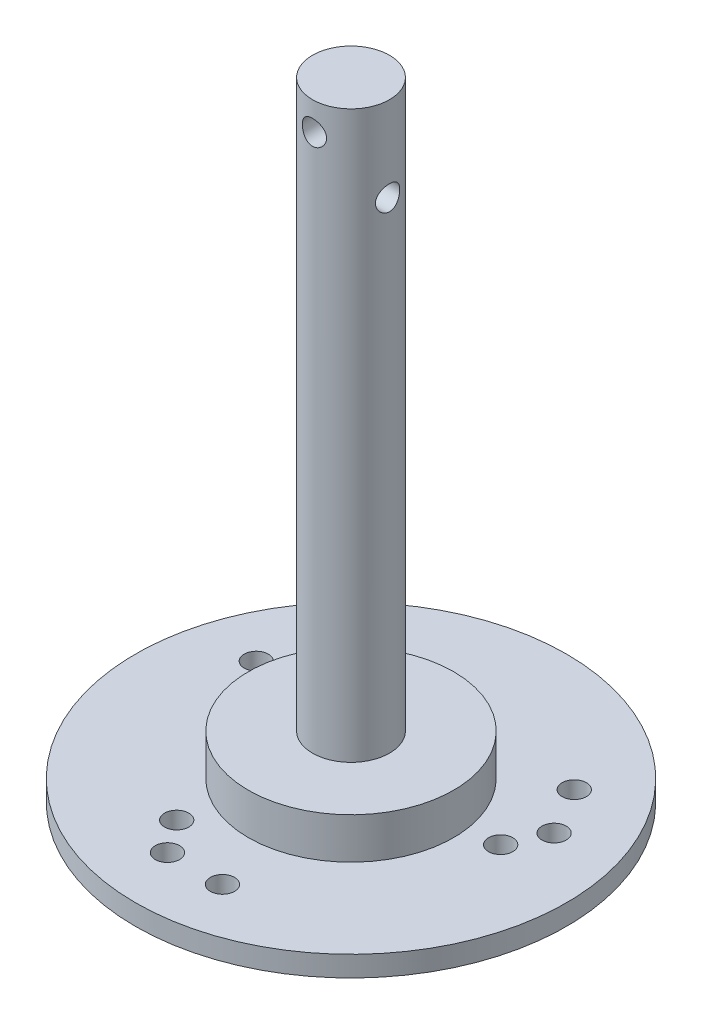
ISO-10303-21;
HEADER;
FILE_DESCRIPTION(('STEP AP214'),'2;1');
FILE_NAME('part.step','',(''),(''),'','','');
FILE_SCHEMA(('AUTOMOTIVE_DESIGN { 1 0 10303 214 1 1 1 1 }'));
ENDSEC;
DATA;
#1=APPLICATION_CONTEXT('core data for automotive mechanical design processes');
#2=APPLICATION_PROTOCOL_DEFINITION('international standard','automotive_design',2000,#1);
#3=PRODUCT_CONTEXT('',#1,'mechanical');
#4=PRODUCT('Part','Part','',(#3));
#5=PRODUCT_RELATED_PRODUCT_CATEGORY('part','',(#4));
#6=PRODUCT_DEFINITION_FORMATION('','',#4);
#7=PRODUCT_DEFINITION_CONTEXT('part definition',#1,'design');
#8=PRODUCT_DEFINITION('design','',#6,#7);
#9=PRODUCT_DEFINITION_SHAPE('','',#8);
#10=(LENGTH_UNIT() NAMED_UNIT(*) SI_UNIT(.MILLI.,.METRE.));
#11=(NAMED_UNIT(*) PLANE_ANGLE_UNIT() SI_UNIT($,.RADIAN.));
#12=(NAMED_UNIT(*) SI_UNIT($,.STERADIAN.) SOLID_ANGLE_UNIT());
#13=UNCERTAINTY_MEASURE_WITH_UNIT(LENGTH_MEASURE(1.E-05),#10,'distance_accuracy_value','');
#14=(GEOMETRIC_REPRESENTATION_CONTEXT(3) GLOBAL_UNCERTAINTY_ASSIGNED_CONTEXT((#13)) GLOBAL_UNIT_ASSIGNED_CONTEXT((#10,
#11,#12)) REPRESENTATION_CONTEXT('',''));
#15=CARTESIAN_POINT('',(0.,0.,0.));
#16=DIRECTION('',(0.,0.,1.));
#17=DIRECTION('',(1.,0.,0.));
#18=AXIS2_PLACEMENT_3D('',#15,#16,#17);
#19=CARTESIAN_POINT('',(0.,77.62,0.));
#20=DIRECTION('',(0.,-1.,0.));
#21=DIRECTION('',(0.,0.,-1.));
#22=AXIS2_PLACEMENT_3D('',#19,#20,#21);
#23=CYLINDRICAL_SURFACE('',#22,4.7625);
#24=CARTESIAN_POINT('',(-4.52011130947015,67.12,-1.5));
#25=CARTESIAN_POINT('',(-4.52011173724343,67.2019804685296,-1.49999954564444));
#26=CARTESIAN_POINT('',(-4.5223660070771,67.2839656635691,-1.49325639445375));
#27=CARTESIAN_POINT('',(-4.53109886590569,67.4455251033046,-1.46654069165984));
#28=CARTESIAN_POINT('',(-4.5375785433984,67.5250987212306,-1.44656473116124));
#29=CARTESIAN_POINT('',(-4.55395708673474,67.6794711832663,-1.39414027161065));
#30=CARTESIAN_POINT('',(-4.56384982516421,67.7542783013962,-1.36171411250472));
#31=CARTESIAN_POINT('',(-4.58593127015384,67.8974118538357,-1.2853844702648));
#32=CARTESIAN_POINT('',(-4.59812039430986,67.9657371060202,-1.24147889904508));
#33=CARTESIAN_POINT('',(-4.62389830861985,68.0963518896077,-1.14179578317613));
#34=CARTESIAN_POINT('',(-4.63751918758323,68.1583819557449,-1.08568647899754));
#35=CARTESIAN_POINT('',(-4.66435305098383,68.272326181884,-0.963898321900081));
#36=CARTESIAN_POINT('',(-4.67756597729999,68.3242389060125,-0.898218112967675));
#37=CARTESIAN_POINT('',(-4.70246276544229,68.4176235014062,-0.7572842441769));
#38=CARTESIAN_POINT('',(-4.71410444532179,68.45882762819,-0.68184506673625));
#39=CARTESIAN_POINT('',(-4.73417193265332,68.5278615624376,-0.524678241098129));
#40=CARTESIAN_POINT('',(-4.74259850851281,68.5556945660024,-0.442952101097874));
#41=CARTESIAN_POINT('',(-4.75505919285339,68.5963282878752,-0.27824841829896));
#42=CARTESIAN_POINT('',(-4.75922263019441,68.609572593071,-0.195390275606228));
#43=CARTESIAN_POINT('',(-4.76314496403151,68.6220590016072,-0.028530253511501));
#44=CARTESIAN_POINT('',(-4.76290487712207,68.6213043367396,0.055471357435676));
#45=CARTESIAN_POINT('',(-4.75813698845721,68.6061048356246,0.21910976515118));
#46=CARTESIAN_POINT('',(-4.7537598306821,68.5921409733277,0.29879632957199));
#47=CARTESIAN_POINT('',(-4.74139534318333,68.5517093628322,0.454631321505635));
#48=CARTESIAN_POINT('',(-4.73340777678625,68.5252407949066,0.530779516706506));
#49=CARTESIAN_POINT('',(-4.71451894088055,68.4602453764246,0.678479225128419));
#50=CARTESIAN_POINT('',(-4.70358290066036,68.4215736231384,0.749962343658782));
#51=CARTESIAN_POINT('',(-4.67994776739616,68.33338617693,0.885573411351457));
#52=CARTESIAN_POINT('',(-4.66724822346395,68.2838677088715,0.949699471797855));
#53=CARTESIAN_POINT('',(-4.6408023227905,68.1729282916547,1.0716434109083));
#54=CARTESIAN_POINT('',(-4.62703440905435,68.1110924648665,1.12907970487737));
#55=CARTESIAN_POINT('',(-4.60046587487755,67.9785389816725,1.23288208823769));
#56=CARTESIAN_POINT('',(-4.58766537228425,67.9078202459594,1.27924683040404));
#57=CARTESIAN_POINT('',(-4.56437114253873,67.7584153005564,1.36004342286531));
#58=CARTESIAN_POINT('',(-4.55390567751298,67.6796467167133,1.39433170656465));
#59=CARTESIAN_POINT('',(-4.53679740489525,67.5170442037247,1.44903645237758));
#60=CARTESIAN_POINT('',(-4.53015319817403,67.4332121409788,1.46945799220596));
#61=CARTESIAN_POINT('',(-4.52175098632741,67.2665229694861,1.49510872950811));
#62=CARTESIAN_POINT('',(-4.51980490166813,67.1837653396618,1.50092310350083));
#63=CARTESIAN_POINT('',(-4.52049667763256,67.0184504608645,1.49883894622849));
#64=CARTESIAN_POINT('',(-4.5231338161791,66.9358931823785,1.49094257506264));
#65=CARTESIAN_POINT('',(-4.53250899846867,66.7758579736384,1.4621843872396));
#66=CARTESIAN_POINT('',(-4.53912367534059,66.6983020434618,1.44171222343744));
#67=CARTESIAN_POINT('',(-4.5555773404356,66.5477354014585,1.38884221695067));
#68=CARTESIAN_POINT('',(-4.56541685997232,66.47472544097,1.35644240900118));
#69=CARTESIAN_POINT('',(-4.5875661685916,66.3329764980495,1.27956359162618));
#70=CARTESIAN_POINT('',(-4.59993939567821,66.2644231123611,1.23476112964434));
#71=CARTESIAN_POINT('',(-4.62563158950432,66.135594549006,1.13472510058494));
#72=CARTESIAN_POINT('',(-4.63895080519946,66.0753215628277,1.07948878123648));
#73=CARTESIAN_POINT('',(-4.66571432896043,65.9621403900783,0.957380822492026));
#74=CARTESIAN_POINT('',(-4.67914019764135,65.9096503207716,0.890116547378786));
#75=CARTESIAN_POINT('',(-4.70404342852271,65.8166850315299,0.747409036881234));
#76=CARTESIAN_POINT('',(-4.7155208781101,65.7762092726899,0.671966168557104));
#77=CARTESIAN_POINT('',(-4.73516965758402,65.7088085866186,0.515499128628182));
#78=CARTESIAN_POINT('',(-4.74336462760992,65.6817864117285,0.434519970360086));
#79=CARTESIAN_POINT('',(-4.75562892693074,65.6418368045526,0.268862186633179));
#80=CARTESIAN_POINT('',(-4.7596995697377,65.6289048847159,0.184184747966871));
#81=CARTESIAN_POINT('',(-4.76316812910613,65.6178720274844,0.0173800030300875));
#82=CARTESIAN_POINT('',(-4.7627561939037,65.6191675910606,-0.0647039004262381));
#83=CARTESIAN_POINT('',(-4.75776280175711,65.6350901316138,-0.227431433827691));
#84=CARTESIAN_POINT('',(-4.7531816240151,65.6497162158843,-0.308075159848632));
#85=CARTESIAN_POINT('',(-4.74042579804042,65.691498338664,-0.464611043112042));
#86=CARTESIAN_POINT('',(-4.73229818227345,65.7184906047111,-0.540551013984441));
#87=CARTESIAN_POINT('',(-4.71328739017827,65.7840905737587,-0.686860162672989));
#88=CARTESIAN_POINT('',(-4.70240373774132,65.8227002839042,-0.757228375201079));
#89=CARTESIAN_POINT('',(-4.67855051458417,65.9119694921417,-0.893022510496728));
#90=CARTESIAN_POINT('',(-4.66552221657063,65.962996767363,-0.95819623605194));
#91=CARTESIAN_POINT('',(-4.63901505495011,66.0750066762613,-1.07925589037362));
#92=CARTESIAN_POINT('',(-4.625536056482,66.1359923113221,-1.13513900873306));
#93=CARTESIAN_POINT('',(-4.59911174194361,66.2686586271034,-1.23793947370086));
#94=CARTESIAN_POINT('',(-4.58619987925646,66.3406312005729,-1.2844897932597));
#95=CARTESIAN_POINT('',(-4.56295119801333,66.4917678493862,-1.36478549823726));
#96=CARTESIAN_POINT('',(-4.55261337918119,66.5709291148252,-1.39853586040865));
#97=CARTESIAN_POINT('',(-4.5364946057853,66.7276347271333,-1.44992789095279));
#98=CARTESIAN_POINT('',(-4.53041341739238,66.8047947180642,-1.46864906697571));
#99=CARTESIAN_POINT('',(-4.522222071456,66.9613020408071,-1.49368375021279));
#100=CARTESIAN_POINT('',(-4.52011089541641,67.0406488063062,-1.50000043978349));
#101=CARTESIAN_POINT('',(-4.52011130947015,67.12,-1.5));
#102=B_SPLINE_CURVE_WITH_KNOTS('',3,(#24,#25,#26,#27,#28,#29,#30,#31,#32,#33,#34,#35,#36,#37,
#38,#39,#40,#41,#42,#43,#44,#45,#46,#47,#48,#49,#50,#51,#52,#53,#54,#55,#56,#57,#58,#59,#60,#61,
#62,#63,#64,#65,#66,#67,#68,#69,#70,#71,#72,#73,#74,#75,#76,#77,#78,#79,#80,#81,#82,#83,#84,#85,
#86,#87,#88,#89,#90,#91,#92,#93,#94,#95,#96,#97,#98,#99,#100,#101),.UNSPECIFIED.,.T.,.F.,(4,2,2,
2,2,2,2,2,2,2,2,2,2,2,2,2,2,2,2,2,2,2,2,2,2,2,2,2,2,2,2,2,2,2,2,2,2,2,4),(0.,0.245648203126428,
0.491359712148026,0.736632375067864,0.981949683748545,1.23503109015801,1.48814838827187,
1.74709020623268,2.0059700984681,2.2567403473535,2.50745270432617,2.74937382904362,
2.9913108147377,3.23623614631163,3.48122421547844,3.73657545717518,3.99195775508278,
4.25028100806216,4.50850961732455,4.75621541436285,5.00388218941215,5.24423725552354,
5.48463194160758,5.73200759515815,5.9794485934769,6.23733132721896,6.49520249181667,
6.75118157446127,7.00707910746647,7.25216544829859,7.49723537761206,7.73914956069726,
7.98110556330012,8.23135791184304,8.48168582447559,8.74047758731523,8.99916862589578,
9.23699943128558,9.47476921348418),.UNSPECIFIED.);
#103=CARTESIAN_POINT('',(-4.52011130947015,67.12,-1.5));
#104=VERTEX_POINT('',#103);
#105=EDGE_CURVE('E34',#104,#104,#102,.T.);
#106=ORIENTED_EDGE('',*,*,#105,.T.);
#107=EDGE_LOOP('',(#106));
#108=FACE_BOUND('',#107,.T.);
#109=CARTESIAN_POINT('',(4.52011130947015,67.12,-1.5));
#110=CARTESIAN_POINT('',(4.52011173724343,67.0380195314704,-1.49999954564444));
#111=CARTESIAN_POINT('',(4.5223660070771,66.9560343364309,-1.49325639445375));
#112=CARTESIAN_POINT('',(4.53109886590569,66.7944748966954,-1.46654069165984));
#113=CARTESIAN_POINT('',(4.5375785433984,66.7149012787694,-1.44656473116124));
#114=CARTESIAN_POINT('',(4.55395708673474,66.5605288167337,-1.39414027161065));
#115=CARTESIAN_POINT('',(4.56384982516421,66.4857216986038,-1.36171411250472));
#116=CARTESIAN_POINT('',(4.58593127015384,66.3425881461643,-1.2853844702648));
#117=CARTESIAN_POINT('',(4.59812039430986,66.2742628939798,-1.24147889904508));
#118=CARTESIAN_POINT('',(4.62389830861985,66.1436481103923,-1.14179578317613));
#119=CARTESIAN_POINT('',(4.63751918758323,66.0816180442551,-1.08568647899754));
#120=CARTESIAN_POINT('',(4.66435305098383,65.9676738181161,-0.963898321900081));
#121=CARTESIAN_POINT('',(4.67756597729999,65.9157610939876,-0.898218112967675));
#122=CARTESIAN_POINT('',(4.70246276544229,65.8223764985939,-0.7572842441769));
#123=CARTESIAN_POINT('',(4.71410444532179,65.78117237181,-0.68184506673625));
#124=CARTESIAN_POINT('',(4.73417193265332,65.7121384375624,-0.524678241098129));
#125=CARTESIAN_POINT('',(4.74259850851281,65.6843054339976,-0.442952101097874));
#126=CARTESIAN_POINT('',(4.75505919285339,65.6436717121248,-0.27824841829896));
#127=CARTESIAN_POINT('',(4.75922263019441,65.630427406929,-0.195390275606228));
#128=CARTESIAN_POINT('',(4.76314496403151,65.6179409983928,-0.028530253511501));
#129=CARTESIAN_POINT('',(4.76290487712207,65.6186956632605,0.055471357435676));
#130=CARTESIAN_POINT('',(4.75813698845721,65.6338951643754,0.21910976515118));
#131=CARTESIAN_POINT('',(4.7537598306821,65.6478590266723,0.29879632957199));
#132=CARTESIAN_POINT('',(4.74139534318333,65.6882906371678,0.454631321505635));
#133=CARTESIAN_POINT('',(4.73340777678625,65.7147592050935,0.530779516706506));
#134=CARTESIAN_POINT('',(4.71451894088055,65.7797546235754,0.678479225128419));
#135=CARTESIAN_POINT('',(4.70358290066036,65.8184263768616,0.749962343658782));
#136=CARTESIAN_POINT('',(4.67994776739616,65.90661382307,0.885573411351457));
#137=CARTESIAN_POINT('',(4.66724822346395,65.9561322911286,0.949699471797855));
#138=CARTESIAN_POINT('',(4.6408023227905,66.0670717083454,1.0716434109083));
#139=CARTESIAN_POINT('',(4.62703440905435,66.1289075351335,1.12907970487737));
#140=CARTESIAN_POINT('',(4.60046587487755,66.2614610183275,1.23288208823769));
#141=CARTESIAN_POINT('',(4.58766537228425,66.3321797540406,1.27924683040404));
#142=CARTESIAN_POINT('',(4.56437114253873,66.4815846994436,1.36004342286531));
#143=CARTESIAN_POINT('',(4.55390567751298,66.5603532832867,1.39433170656465));
#144=CARTESIAN_POINT('',(4.53679740489525,66.7229557962753,1.44903645237758));
#145=CARTESIAN_POINT('',(4.53015319817403,66.8067878590212,1.46945799220596));
#146=CARTESIAN_POINT('',(4.52175098632741,66.9734770305139,1.49510872950811));
#147=CARTESIAN_POINT('',(4.51980490166813,67.0562346603382,1.50092310350083));
#148=CARTESIAN_POINT('',(4.52049667763256,67.2215495391356,1.49883894622849));
#149=CARTESIAN_POINT('',(4.5231338161791,67.3041068176215,1.49094257506264));
#150=CARTESIAN_POINT('',(4.53250899846867,67.4641420263616,1.4621843872396));
#151=CARTESIAN_POINT('',(4.53912367534059,67.5416979565382,1.44171222343744));
#152=CARTESIAN_POINT('',(4.55557734043559,67.6922645985415,1.38884221695067));
#153=CARTESIAN_POINT('',(4.56541685997232,67.76527455903,1.35644240900118));
#154=CARTESIAN_POINT('',(4.5875661685916,67.9070235019505,1.27956359162618));
#155=CARTESIAN_POINT('',(4.59993939567821,67.9755768876389,1.23476112964434));
#156=CARTESIAN_POINT('',(4.62563158950432,68.104405450994,1.13472510058494));
#157=CARTESIAN_POINT('',(4.63895080519946,68.1646784371723,1.07948878123648));
#158=CARTESIAN_POINT('',(4.66571432896043,68.2778596099217,0.957380822492026));
#159=CARTESIAN_POINT('',(4.67914019764135,68.3303496792284,0.890116547378786));
#160=CARTESIAN_POINT('',(4.70404342852271,68.4233149684702,0.747409036881234));
#161=CARTESIAN_POINT('',(4.7155208781101,68.4637907273101,0.671966168557104));
#162=CARTESIAN_POINT('',(4.73516965758402,68.5311914133814,0.515499128628181));
#163=CARTESIAN_POINT('',(4.74336462760992,68.5582135882715,0.434519970360084));
#164=CARTESIAN_POINT('',(4.75562892693074,68.5981631954475,0.268862186633177));
#165=CARTESIAN_POINT('',(4.7596995697377,68.6110951152841,0.18418474796687));
#166=CARTESIAN_POINT('',(4.76316812910613,68.6221279725157,0.0173800030300876));
#167=CARTESIAN_POINT('',(4.7627561939037,68.6208324089394,-0.0647039004262381));
#168=CARTESIAN_POINT('',(4.75776280175711,68.6049098683862,-0.227431433827691));
#169=CARTESIAN_POINT('',(4.7531816240151,68.5902837841157,-0.308075159848632));
#170=CARTESIAN_POINT('',(4.74042579804042,68.548501661336,-0.464611043112042));
#171=CARTESIAN_POINT('',(4.73229818227345,68.5215093952889,-0.540551013984441));
#172=CARTESIAN_POINT('',(4.71328739017827,68.4559094262413,-0.686860162672989));
#173=CARTESIAN_POINT('',(4.70240373774132,68.4172997160959,-0.757228375201079));
#174=CARTESIAN_POINT('',(4.67855051458417,68.3280305078583,-0.893022510496728));
#175=CARTESIAN_POINT('',(4.66552221657063,68.2770032326371,-0.95819623605194));
#176=CARTESIAN_POINT('',(4.63901505495011,68.1649933237387,-1.07925589037362));
#177=CARTESIAN_POINT('',(4.625536056482,68.104007688678,-1.13513900873306));
#178=CARTESIAN_POINT('',(4.59911174194361,67.9713413728966,-1.23793947370086));
#179=CARTESIAN_POINT('',(4.58619987925646,67.8993687994271,-1.2844897932597));
#180=CARTESIAN_POINT('',(4.56295119801333,67.7482321506138,-1.36478549823726));
#181=CARTESIAN_POINT('',(4.55261337918119,67.6690708851748,-1.39853586040865));
#182=CARTESIAN_POINT('',(4.5364946057853,67.5123652728667,-1.44992789095279));
#183=CARTESIAN_POINT('',(4.53041341739238,67.4352052819358,-1.46864906697571));
#184=CARTESIAN_POINT('',(4.522222071456,67.2786979591929,-1.49368375021279));
#185=CARTESIAN_POINT('',(4.52011089541641,67.1993511936938,-1.50000043978349));
#186=CARTESIAN_POINT('',(4.52011130947015,67.12,-1.5));
#187=B_SPLINE_CURVE_WITH_KNOTS('',3,(#109,#110,#111,#112,#113,#114,#115,#116,#117,#118,#119,
#120,#121,#122,#123,#124,#125,#126,#127,#128,#129,#130,#131,#132,#133,#134,#135,#136,#137,#138,
#139,#140,#141,#142,#143,#144,#145,#146,#147,#148,#149,#150,#151,#152,#153,#154,#155,#156,#157,
#158,#159,#160,#161,#162,#163,#164,#165,#166,#167,#168,#169,#170,#171,#172,#173,#174,#175,#176,
#177,#178,#179,#180,#181,#182,#183,#184,#185,#186),.UNSPECIFIED.,.T.,.F.,(4,2,2,2,2,2,2,2,2,2,2,
2,2,2,2,2,2,2,2,2,2,2,2,2,2,2,2,2,2,2,2,2,2,2,2,2,2,2,4),(0.,0.245648203126428,
0.491359712148026,0.736632375067864,0.981949683748545,1.23503109015801,1.48814838827187,
1.74709020623268,2.0059700984681,2.2567403473535,2.50745270432617,2.74937382904362,
2.9913108147377,3.23623614631163,3.48122421547844,3.73657545717518,3.99195775508278,
4.25028100806216,4.50850961732455,4.75621541436285,5.00388218941215,5.24423725552352,
5.48463194160758,5.73200759515815,5.9794485934769,6.23733132721896,6.49520249181667,
6.75118157446127,7.00707910746647,7.25216544829859,7.49723537761206,7.73914956069726,
7.98110556330012,8.23135791184304,8.48168582447559,8.74047758731523,8.99916862589578,
9.23699943128558,9.47476921348418),.UNSPECIFIED.);
#188=CARTESIAN_POINT('',(4.52011130947015,67.12,-1.5));
#189=VERTEX_POINT('',#188);
#190=EDGE_CURVE('E134',#189,#189,#187,.T.);
#191=ORIENTED_EDGE('',*,*,#190,.T.);
#192=EDGE_LOOP('',(#191));
#193=FACE_BOUND('',#192,.T.);
#194=CARTESIAN_POINT('',(0.,77.62,0.));
#195=DIRECTION('',(0.,1.,0.));
#196=DIRECTION('',(0.,0.,1.));
#197=AXIS2_PLACEMENT_3D('',#194,#195,#196);
#198=CIRCLE('',#197,4.7625);
#199=CARTESIAN_POINT('',(0.,77.62,4.7625));
#200=VERTEX_POINT('',#199);
#201=EDGE_CURVE('E137',#200,#200,#198,.T.);
#202=ORIENTED_EDGE('',*,*,#201,.F.);
#203=EDGE_LOOP('',(#202));
#204=FACE_BOUND('',#203,.T.);
#205=CARTESIAN_POINT('',(0.,7.62,0.));
#206=DIRECTION('',(0.,1.,0.));
#207=DIRECTION('',(0.,0.,1.));
#208=AXIS2_PLACEMENT_3D('',#205,#206,#207);
#209=CIRCLE('',#208,4.7625);
#210=CARTESIAN_POINT('',(0.,7.62,4.7625));
#211=VERTEX_POINT('',#210);
#212=EDGE_CURVE('E141',#211,#211,#209,.T.);
#213=ORIENTED_EDGE('',*,*,#212,.T.);
#214=EDGE_LOOP('',(#213));
#215=FACE_BOUND('',#214,.T.);
#216=CARTESIAN_POINT('',(-1.5,74.12,4.52011130947016));
#217=CARTESIAN_POINT('',(-1.49999954564444,74.0380195314704,4.52011173724343));
#218=CARTESIAN_POINT('',(-1.49325639445375,73.9560343364309,4.5223660070771));
#219=CARTESIAN_POINT('',(-1.46654069165984,73.7944748966954,4.53109886590569));
#220=CARTESIAN_POINT('',(-1.44656473116124,73.7149012787694,4.5375785433984));
#221=CARTESIAN_POINT('',(-1.39414027161065,73.5605288167337,4.55395708673474));
#222=CARTESIAN_POINT('',(-1.36171411250471,73.4857216986038,4.56384982516422));
#223=CARTESIAN_POINT('',(-1.28538447026479,73.3425881461643,4.58593127015385));
#224=CARTESIAN_POINT('',(-1.24147889904508,73.2742628939798,4.59812039430986));
#225=CARTESIAN_POINT('',(-1.14179578317613,73.1436481103923,4.62389830861985));
#226=CARTESIAN_POINT('',(-1.08568647899755,73.0816180442551,4.63751918758323));
#227=CARTESIAN_POINT('',(-0.963898321900085,72.9676738181161,4.66435305098383));
#228=CARTESIAN_POINT('',(-0.898218112967676,72.9157610939876,4.67756597729999));
#229=CARTESIAN_POINT('',(-0.757284244176896,72.8223764985939,4.70246276544229));
#230=CARTESIAN_POINT('',(-0.681845066736244,72.78117237181,4.7141044453218));
#231=CARTESIAN_POINT('',(-0.524678241098124,72.7121384375624,4.73417193265332));
#232=CARTESIAN_POINT('',(-0.44295210109787,72.6843054339976,4.74259850851281));
#233=CARTESIAN_POINT('',(-0.278248418298957,72.6436717121248,4.75505919285339));
#234=CARTESIAN_POINT('',(-0.195390275606224,72.630427406929,4.75922263019441));
#235=CARTESIAN_POINT('',(-0.028530253511497,72.6179409983928,4.76314496403151));
#236=CARTESIAN_POINT('',(0.0554713574356791,72.6186956632604,4.76290487712207));
#237=CARTESIAN_POINT('',(0.219109765151183,72.6338951643754,4.75813698845721));
#238=CARTESIAN_POINT('',(0.298796329571994,72.6478590266723,4.7537598306821));
#239=CARTESIAN_POINT('',(0.454631321505639,72.6882906371678,4.74139534318333));
#240=CARTESIAN_POINT('',(0.530779516706508,72.7147592050935,4.73340777678625));
#241=CARTESIAN_POINT('',(0.678479225128419,72.7797546235754,4.71451894088055));
#242=CARTESIAN_POINT('',(0.749962343658782,72.8184263768616,4.70358290066036));
#243=CARTESIAN_POINT('',(0.885573411351458,72.90661382307,4.67994776739616));
#244=CARTESIAN_POINT('',(0.949699471797856,72.9561322911286,4.66724822346395));
#245=CARTESIAN_POINT('',(1.0716434109083,73.0670717083454,4.6408023227905));
#246=CARTESIAN_POINT('',(1.12907970487736,73.1289075351335,4.62703440905435));
#247=CARTESIAN_POINT('',(1.23288208823768,73.2614610183275,4.60046587487756));
#248=CARTESIAN_POINT('',(1.27924683040404,73.3321797540406,4.58766537228425));
#249=CARTESIAN_POINT('',(1.36004342286532,73.4815846994436,4.56437114253873));
#250=CARTESIAN_POINT('',(1.39433170656465,73.5603532832867,4.55390567751298));
#251=CARTESIAN_POINT('',(1.44903645237758,73.7229557962753,4.53679740489525));
#252=CARTESIAN_POINT('',(1.46945799220596,73.8067878590212,4.53015319817403));
#253=CARTESIAN_POINT('',(1.49510872950811,73.9734770305139,4.52175098632741));
#254=CARTESIAN_POINT('',(1.50092310350083,74.0562346603382,4.51980490166813));
#255=CARTESIAN_POINT('',(1.49883894622849,74.2215495391355,4.52049667763256));
#256=CARTESIAN_POINT('',(1.49094257506264,74.3041068176215,4.5231338161791));
#257=CARTESIAN_POINT('',(1.4621843872396,74.4641420263616,4.53250899846867));
#258=CARTESIAN_POINT('',(1.44171222343744,74.5416979565382,4.53912367534059));
#259=CARTESIAN_POINT('',(1.38884221695067,74.6922645985415,4.55557734043559));
#260=CARTESIAN_POINT('',(1.35644240900119,74.76527455903,4.56541685997232));
#261=CARTESIAN_POINT('',(1.27956359162618,74.9070235019505,4.5875661685916));
#262=CARTESIAN_POINT('',(1.23476112964434,74.9755768876389,4.59993939567821));
#263=CARTESIAN_POINT('',(1.13472510058493,75.104405450994,4.62563158950432));
#264=CARTESIAN_POINT('',(1.07948878123648,75.1646784371723,4.63895080519946));
#265=CARTESIAN_POINT('',(0.957380822492027,75.2778596099217,4.66571432896043));
#266=CARTESIAN_POINT('',(0.890116547378786,75.3303496792284,4.67914019764135));
#267=CARTESIAN_POINT('',(0.747409036881234,75.4233149684701,4.70404342852271));
#268=CARTESIAN_POINT('',(0.671966168557105,75.4637907273101,4.7155208781101));
#269=CARTESIAN_POINT('',(0.515499128628181,75.5311914133814,4.73516965758402));
#270=CARTESIAN_POINT('',(0.434519970360084,75.5582135882715,4.74336462760992));
#271=CARTESIAN_POINT('',(0.268862186633181,75.5981631954474,4.75562892693074));
#272=CARTESIAN_POINT('',(0.184184747966878,75.6110951152841,4.7596995697377));
#273=CARTESIAN_POINT('',(0.0173800030300984,75.6221279725157,4.76316812910613));
#274=CARTESIAN_POINT('',(-0.0647039004262289,75.6208324089394,4.76275619390371));
#275=CARTESIAN_POINT('',(-0.227431433827686,75.6049098683862,4.75776280175711));
#276=CARTESIAN_POINT('',(-0.308075159848628,75.5902837841157,4.7531816240151));
#277=CARTESIAN_POINT('',(-0.464611043112038,75.548501661336,4.74042579804042));
#278=CARTESIAN_POINT('',(-0.540551013984435,75.5215093952889,4.73229818227345));
#279=CARTESIAN_POINT('',(-0.686860162672982,75.4559094262413,4.71328739017827));
#280=CARTESIAN_POINT('',(-0.757228375201074,75.4172997160959,4.70240373774132));
#281=CARTESIAN_POINT('',(-0.893022510496727,75.3280305078583,4.67855051458417));
#282=CARTESIAN_POINT('',(-0.958196236051942,75.277003232637,4.66552221657063));
#283=CARTESIAN_POINT('',(-1.07925589037362,75.1649933237387,4.63901505495011));
#284=CARTESIAN_POINT('',(-1.13513900873306,75.104007688678,4.625536056482));
#285=CARTESIAN_POINT('',(-1.23793947370086,74.9713413728966,4.59911174194361));
#286=CARTESIAN_POINT('',(-1.2844897932597,74.8993687994271,4.58619987925646));
#287=CARTESIAN_POINT('',(-1.36478549823726,74.7482321506138,4.56295119801333));
#288=CARTESIAN_POINT('',(-1.39853586040865,74.6690708851748,4.5526133791812));
#289=CARTESIAN_POINT('',(-1.44992789095279,74.5123652728667,4.5364946057853));
#290=CARTESIAN_POINT('',(-1.46864906697571,74.4352052819358,4.53041341739238));
#291=CARTESIAN_POINT('',(-1.49368375021279,74.2786979591929,4.52222207145601));
#292=CARTESIAN_POINT('',(-1.50000043978349,74.1993511936938,4.52011089541641));
#293=CARTESIAN_POINT('',(-1.5,74.12,4.52011130947016));
#294=B_SPLINE_CURVE_WITH_KNOTS('',3,(#216,#217,#218,#219,#220,#221,#222,#223,#224,#225,#226,
#227,#228,#229,#230,#231,#232,#233,#234,#235,#236,#237,#238,#239,#240,#241,#242,#243,#244,#245,
#246,#247,#248,#249,#250,#251,#252,#253,#254,#255,#256,#257,#258,#259,#260,#261,#262,#263,#264,
#265,#266,#267,#268,#269,#270,#271,#272,#273,#274,#275,#276,#277,#278,#279,#280,#281,#282,#283,
#284,#285,#286,#287,#288,#289,#290,#291,#292,#293),.UNSPECIFIED.,.T.,.F.,(4,2,2,2,2,2,2,2,2,2,2,
2,2,2,2,2,2,2,2,2,2,2,2,2,2,2,2,2,2,2,2,2,2,2,2,2,2,2,4),(0.,0.245648203126428,
0.491359712148026,0.73663237506788,0.981949683748546,1.23503109015801,1.48814838827187,
1.74709020623269,2.0059700984681,2.2567403473535,2.50745270432617,2.74937382904362,
2.99131081473769,3.23623614631162,3.48122421547843,3.73657545717517,3.99195775508277,
4.25028100806217,4.50850961732454,4.75621541436285,5.00388218941215,5.24423725552352,
5.48463194160758,5.73200759515814,5.9794485934769,6.23733132721896,6.49520249181667,
6.75118157446126,7.00707910746645,7.25216544829857,7.49723537761204,7.73914956069724,
7.98110556330011,8.23135791184303,8.48168582447558,8.74047758731523,8.99916862589578,
9.23699943128559,9.47476921348417),.UNSPECIFIED.);
#295=CARTESIAN_POINT('',(-1.5,74.12,4.52011130947016));
#296=VERTEX_POINT('',#295);
#297=EDGE_CURVE('E54',#296,#296,#294,.T.);
#298=ORIENTED_EDGE('',*,*,#297,.F.);
#299=EDGE_LOOP('',(#298));
#300=FACE_BOUND('',#299,.T.);
#301=CARTESIAN_POINT('',(0.,75.62,-4.7625));
#302=CARTESIAN_POINT('',(0.082094536907181,75.6199995623379,-4.76249965633041));
#303=CARTESIAN_POINT('',(0.164193787469988,75.6132383096738,-4.76035733490875));
#304=CARTESIAN_POINT('',(0.325989355341718,75.5864441881315,-4.75202120517305));
#305=CARTESIAN_POINT('',(0.405685159405637,75.5664085052491,-4.74582653781861));
#306=CARTESIAN_POINT('',(0.560317406743354,75.5138096294532,-4.73006202417898));
#307=CARTESIAN_POINT('',(0.635261073505161,75.4812660082106,-4.72049745285487));
#308=CARTESIAN_POINT('',(0.778627633748063,75.4046589197923,-4.69897937584265));
#309=CARTESIAN_POINT('',(0.847049466091455,75.360593582322,-4.68702548237547));
#310=CARTESIAN_POINT('',(0.977573385140228,75.2607414790958,-4.66157762848587));
#311=CARTESIAN_POINT('',(1.03944258820892,75.2046589802329,-4.64804972270609));
#312=CARTESIAN_POINT('',(1.15307123875255,75.0829940956753,-4.62117398380975));
#313=CARTESIAN_POINT('',(1.2048287662608,75.0174099099453,-4.60782618533831));
#314=CARTESIAN_POINT('',(1.2980352255659,74.8765780296787,-4.58245665177123));
#315=CARTESIAN_POINT('',(1.33919187571196,74.8011286420788,-4.570476753683));
#316=CARTESIAN_POINT('',(1.40813539569475,74.643941010047,-4.54971062762424));
#317=CARTESIAN_POINT('',(1.4359258507859,74.5622044588705,-4.54092354339052));
#318=CARTESIAN_POINT('',(1.47649347933875,74.3973930743414,-4.52789329226847));
#319=CARTESIAN_POINT('',(1.48970317080108,74.3144353149387,-4.52351957015627));
#320=CARTESIAN_POINT('',(1.50208565416968,74.1473745787985,-4.51942379053361));
#321=CARTESIAN_POINT('',(1.5012622456786,74.0632719182167,-4.51970047387891));
#322=CARTESIAN_POINT('',(1.48593990457235,73.8998990280928,-4.52475909866256));
#323=CARTESIAN_POINT('',(1.47199243903719,73.8205705015541,-4.5293593562801));
#324=CARTESIAN_POINT('',(1.43171266030327,73.6654422992858,-4.54225139984358));
#325=CARTESIAN_POINT('',(1.4053790118732,73.5896430049761,-4.55054358377425));
#326=CARTESIAN_POINT('',(1.34068825559667,73.4424182518907,-4.57002326365268));
#327=CARTESIAN_POINT('',(1.30215911901963,73.3710740404905,-4.58125175846588));
#328=CARTESIAN_POINT('',(1.2142905498588,73.235683458874,-4.60532029330138));
#329=CARTESIAN_POINT('',(1.16494827196171,73.1716390162359,-4.61816075710818));
#330=CARTESIAN_POINT('',(1.05415461040916,73.0495504075805,-4.64473368295849));
#331=CARTESIAN_POINT('',(0.992248468535766,72.9919211578072,-4.65847992322403));
#332=CARTESIAN_POINT('',(0.859479657954419,72.8877604429941,-4.68479187764646));
#333=CARTESIAN_POINT('',(0.788616305204882,72.8412298263156,-4.6973575015145));
#334=CARTESIAN_POINT('',(0.639135790706978,72.7603000929653,-4.7200279737994));
#335=CARTESIAN_POINT('',(0.560460962776133,72.7260013389057,-4.73011226304221));
#336=CARTESIAN_POINT('',(0.398066548928305,72.6712491095779,-4.74653535191695));
#337=CARTESIAN_POINT('',(0.314348528753348,72.6507913610224,-4.75287530750173));
#338=CARTESIAN_POINT('',(0.147765013376512,72.6250118991341,-4.76090874681444));
#339=CARTESIAN_POINT('',(0.0649946070903001,72.6191286131288,-4.7627745307481));
#340=CARTESIAN_POINT('',(-0.100360444771533,72.6210798510849,-4.76215981330131));
#341=CARTESIAN_POINT('',(-0.182945116132882,72.628912335908,-4.75967995799163));
#342=CARTESIAN_POINT('',(-0.343408978341597,72.6576226539041,-4.75076588977077));
#343=CARTESIAN_POINT('',(-0.42135436808235,72.6781651225467,-4.74443340162375));
#344=CARTESIAN_POINT('',(-0.572669344842182,72.731301913725,-4.72855672083735));
#345=CARTESIAN_POINT('',(-0.646038362799993,72.7638977315893,-4.71901212972037));
#346=CARTESIAN_POINT('',(-0.788127309045249,72.8411121857781,-4.69739892229091));
#347=CARTESIAN_POINT('',(-0.856688326150848,72.8860070388512,-4.68527395525525));
#348=CARTESIAN_POINT('',(-0.985491247359132,72.9862145887291,-4.65988518856733));
#349=CARTESIAN_POINT('',(-1.04573085352575,73.041530153258,-4.64662107597635));
#350=CARTESIAN_POINT('',(-1.15870122199633,73.1636504773765,-4.61977573530888));
#351=CARTESIAN_POINT('',(-1.2110316398585,73.2308283591882,-4.60620326372205));
#352=CARTESIAN_POINT('',(-1.30371412525518,73.3733068123863,-4.58083536347193));
#353=CARTESIAN_POINT('',(-1.34406635449743,73.4486072740977,-4.56903991081962));
#354=CARTESIAN_POINT('',(-1.4114022941131,73.6050569182505,-4.54869102868255));
#355=CARTESIAN_POINT('',(-1.43843533613887,73.6861832233374,-4.54012566368301));
#356=CARTESIAN_POINT('',(-1.47835757578596,73.8521622222838,-4.52728543883964));
#357=CARTESIAN_POINT('',(-1.49125226587418,73.9370134557505,-4.52300891292274));
#358=CARTESIAN_POINT('',(-1.50213329527909,74.1038431623748,-4.51940603913958));
#359=CARTESIAN_POINT('',(-1.50077725759128,74.1857745518758,-4.51986132310091));
#360=CARTESIAN_POINT('',(-1.48478641638879,74.3481804594342,-4.52513920474682));
#361=CARTESIAN_POINT('',(-1.47015225079996,74.4286550472916,-4.52996159262105));
#362=CARTESIAN_POINT('',(-1.42846381007867,74.5846665797947,-4.54327654286431));
#363=CARTESIAN_POINT('',(-1.40160055492572,74.6602597610437,-4.55171254463354));
#364=CARTESIAN_POINT('',(-1.3363673399038,74.8059261172836,-4.57128897948953));
#365=CARTESIAN_POINT('',(-1.29799501303215,74.8759981530265,-4.58242996880518));
#366=CARTESIAN_POINT('',(-1.20905375077334,75.0116415016392,-4.6067122236184));
#367=CARTESIAN_POINT('',(-1.1580615045792,75.0769241536678,-4.61991529010257));
#368=CARTESIAN_POINT('',(-1.04606936092166,75.1982188705624,-4.64655286799697));
#369=CARTESIAN_POINT('',(-0.985066769744959,75.2542284319329,-4.65998744083064));
#370=CARTESIAN_POINT('',(-0.852337671808275,75.3572589418869,-4.68611197873369));
#371=CARTESIAN_POINT('',(-0.780321315090257,75.4039177183846,-4.69876215513452));
#372=CARTESIAN_POINT('',(-0.629069319243527,75.4844059107037,-4.7213887487882));
#373=CARTESIAN_POINT('',(-0.549836421342033,75.5182401729596,-4.73136617566482));
#374=CARTESIAN_POINT('',(-0.392943063442471,75.56977910827,-4.74686332916704));
#375=CARTESIAN_POINT('',(-0.31566328572181,75.5885570170746,-4.75267565817897));
#376=CARTESIAN_POINT('',(-0.15892350315109,75.6136663676596,-4.76049376016996));
#377=CARTESIAN_POINT('',(-0.0794639597823566,75.620000423638,-4.7625003326573));
#378=CARTESIAN_POINT('',(0.,75.62,-4.7625));
#379=B_SPLINE_CURVE_WITH_KNOTS('',3,(#301,#302,#303,#304,#305,#306,#307,#308,#309,#310,#311,
#312,#313,#314,#315,#316,#317,#318,#319,#320,#321,#322,#323,#324,#325,#326,#327,#328,#329,#330,
#331,#332,#333,#334,#335,#336,#337,#338,#339,#340,#341,#342,#343,#344,#345,#346,#347,#348,#349,
#350,#351,#352,#353,#354,#355,#356,#357,#358,#359,#360,#361,#362,#363,#364,#365,#366,#367,#368,
#369,#370,#371,#372,#373,#374,#375,#376,#377,#378),.UNSPECIFIED.,.T.,.F.,(4,2,2,2,2,2,2,2,2,2,2,
2,2,2,2,2,2,2,2,2,2,2,2,2,2,2,2,2,2,2,2,2,2,2,2,2,2,2,4),(0.,0.245991487918507,
0.492035139482208,0.73769535387981,0.983395470536571,1.2360304855473,1.48871342341659,
1.74775686839307,2.0067307905676,2.25779696574049,2.50879516330715,2.74969628611144,
2.99062338402578,3.23511298158656,3.47966699027089,3.73553999577007,3.99143255352098,
4.24937886212958,4.50724549572221,4.75500992569458,5.00273752339217,5.24419201539835,
5.48567647210288,5.73310564403126,5.98060300687517,6.23807258153874,6.49553868015744,
6.75204386882261,7.00844937500839,7.2530765951223,7.49769206314557,7.73861118287287,
7.97957988502496,8.23010408286662,8.48069580588702,8.7396468651946,8.99849996807425,
9.23665912289073,9.47476824000359),.UNSPECIFIED.);
#380=CARTESIAN_POINT('',(0.,75.62,-4.7625));
#381=VERTEX_POINT('',#380);
#382=EDGE_CURVE('E61',#381,#381,#379,.T.);
#383=ORIENTED_EDGE('',*,*,#382,.F.);
#384=EDGE_LOOP('',(#383));
#385=FACE_BOUND('',#384,.T.);
#386=ADVANCED_FACE('F30',(#108,#193,#204,#215,#300,#385),#23,.T.);
#387=CARTESIAN_POINT('',(0.,2.54,0.));
#388=DIRECTION('',(0.,-1.,0.));
#389=DIRECTION('',(0.,0.,-1.));
#390=AXIS2_PLACEMENT_3D('',#387,#388,#389);
#391=CYLINDRICAL_SURFACE('',#390,26.65);
#392=CARTESIAN_POINT('',(0.,2.54,0.));
#393=DIRECTION('',(0.,1.,0.));
#394=DIRECTION('',(0.,0.,1.));
#395=AXIS2_PLACEMENT_3D('',#392,#393,#394);
#396=CIRCLE('',#395,26.65);
#397=CARTESIAN_POINT('',(0.,2.54,26.65));
#398=VERTEX_POINT('',#397);
#399=EDGE_CURVE('E10',#398,#398,#396,.T.);
#400=ORIENTED_EDGE('',*,*,#399,.F.);
#401=EDGE_LOOP('',(#400));
#402=FACE_BOUND('',#401,.T.);
#403=CARTESIAN_POINT('',(0.,0.,0.));
#404=DIRECTION('',(0.,1.,0.));
#405=DIRECTION('',(0.,0.,1.));
#406=AXIS2_PLACEMENT_3D('',#403,#404,#405);
#407=CIRCLE('',#406,26.65);
#408=CARTESIAN_POINT('',(0.,0.,26.65));
#409=VERTEX_POINT('',#408);
#410=EDGE_CURVE('E43',#409,#409,#407,.T.);
#411=ORIENTED_EDGE('',*,*,#410,.T.);
#412=EDGE_LOOP('',(#411));
#413=FACE_BOUND('',#412,.T.);
#414=ADVANCED_FACE('F32',(#402,#413),#391,.T.);
#415=CARTESIAN_POINT('',(0.,2.54,0.));
#416=DIRECTION('',(0.,1.,0.));
#417=DIRECTION('',(0.,0.,1.));
#418=AXIS2_PLACEMENT_3D('',#415,#416,#417);
#419=PLANE('',#418);
#420=CARTESIAN_POINT('',(-3.40350428227159,2.54,19.3022319590393));
#421=DIRECTION('',(0.,1.,0.));
#422=DIRECTION('',(0.,0.,1.));
#423=AXIS2_PLACEMENT_3D('',#420,#421,#422);
#424=CIRCLE('',#423,1.5);
#425=CARTESIAN_POINT('',(-3.40350428227159,2.54,20.8022319590393));
#426=VERTEX_POINT('',#425);
#427=EDGE_CURVE('E192',#426,#426,#424,.T.);
#428=ORIENTED_EDGE('',*,*,#427,.F.);
#429=EDGE_LOOP('',(#428));
#430=FACE_BOUND('',#429,.T.);
#431=CARTESIAN_POINT('',(-18.4179753674039,2.54,-6.70359480918293));
#432=DIRECTION('',(0.,1.,0.));
#433=DIRECTION('',(0.,0.,1.));
#434=AXIS2_PLACEMENT_3D('',#431,#432,#433);
#435=CIRCLE('',#434,1.5);
#436=CARTESIAN_POINT('',(-18.4179753674039,2.54,-5.20359480918293));
#437=VERTEX_POINT('',#436);
#438=EDGE_CURVE('E189',#437,#437,#435,.T.);
#439=ORIENTED_EDGE('',*,*,#438,.F.);
#440=EDGE_LOOP('',(#439));
#441=FACE_BOUND('',#440,.T.);
#442=CARTESIAN_POINT('',(-15.0144710851321,2.54,-12.598637149856));
#443=DIRECTION('',(0.,1.,0.));
#444=DIRECTION('',(0.,0.,1.));
#445=AXIS2_PLACEMENT_3D('',#442,#443,#444);
#446=CIRCLE('',#445,1.5);
#447=CARTESIAN_POINT('',(-15.0144710851321,2.54,-11.098637149856));
#448=VERTEX_POINT('',#447);
#449=EDGE_CURVE('E186',#448,#448,#446,.T.);
#450=ORIENTED_EDGE('',*,*,#449,.F.);
#451=EDGE_LOOP('',(#450));
#452=FACE_BOUND('',#451,.T.);
#453=CARTESIAN_POINT('',(15.0144710851319,2.54,-12.5986371498563));
#454=DIRECTION('',(0.,1.,0.));
#455=DIRECTION('',(0.,0.,1.));
#456=AXIS2_PLACEMENT_3D('',#453,#454,#455);
#457=CIRCLE('',#456,1.5);
#458=CARTESIAN_POINT('',(15.0144710851319,2.54,-11.0986371498563));
#459=VERTEX_POINT('',#458);
#460=EDGE_CURVE('E183',#459,#459,#457,.T.);
#461=ORIENTED_EDGE('',*,*,#460,.F.);
#462=EDGE_LOOP('',(#461));
#463=FACE_BOUND('',#462,.T.);
#464=CARTESIAN_POINT('',(18.4179753674038,2.54,-6.70359480918319));
#465=DIRECTION('',(0.,1.,0.));
#466=DIRECTION('',(0.,0.,1.));
#467=AXIS2_PLACEMENT_3D('',#464,#465,#466);
#468=CIRCLE('',#467,1.5);
#469=CARTESIAN_POINT('',(18.4179753674038,2.54,-5.20359480918318));
#470=VERTEX_POINT('',#469);
#471=EDGE_CURVE('E180',#470,#470,#468,.T.);
#472=ORIENTED_EDGE('',*,*,#471,.F.);
#473=EDGE_LOOP('',(#472));
#474=FACE_BOUND('',#473,.T.);
#475=CARTESIAN_POINT('',(-10.0438146715101,2.54,-13.0893541200265));
#476=DIRECTION('',(0.,1.,0.));
#477=DIRECTION('',(0.,0.,1.));
#478=AXIS2_PLACEMENT_3D('',#475,#476,#477);
#479=CIRCLE('',#478,1.5);
#480=CARTESIAN_POINT('',(-10.0438146715101,2.54,-11.5893541200265));
#481=VERTEX_POINT('',#480);
#482=EDGE_CURVE('E177',#481,#481,#479,.T.);
#483=ORIENTED_EDGE('',*,*,#482,.F.);
#484=EDGE_LOOP('',(#483));
#485=FACE_BOUND('',#484,.T.);
#486=CARTESIAN_POINT('',(16.3576205228285,2.54,-2.15352159641728));
#487=DIRECTION('',(0.,1.,0.));
#488=DIRECTION('',(0.,0.,1.));
#489=AXIS2_PLACEMENT_3D('',#486,#487,#488);
#490=CIRCLE('',#489,1.5);
#491=CARTESIAN_POINT('',(16.3576205228285,2.54,-0.653521596417276));
#492=VERTEX_POINT('',#491);
#493=EDGE_CURVE('E174',#492,#492,#490,.T.);
#494=ORIENTED_EDGE('',*,*,#493,.F.);
#495=EDGE_LOOP('',(#494));
#496=FACE_BOUND('',#495,.T.);
#497=CARTESIAN_POINT('',(3.40350428227184,2.54,19.3022319590393));
#498=DIRECTION('',(0.,1.,0.));
#499=DIRECTION('',(0.,0.,1.));
#500=AXIS2_PLACEMENT_3D('',#497,#498,#499);
#501=CIRCLE('',#500,1.5);
#502=CARTESIAN_POINT('',(3.40350428227184,2.54,20.8022319590393));
#503=VERTEX_POINT('',#502);
#504=EDGE_CURVE('E161',#503,#503,#501,.T.);
#505=ORIENTED_EDGE('',*,*,#504,.F.);
#506=EDGE_LOOP('',(#505));
#507=FACE_BOUND('',#506,.T.);
#508=CARTESIAN_POINT('',(-6.31380585131853,2.54,15.2428757164438));
#509=DIRECTION('',(0.,1.,0.));
#510=DIRECTION('',(0.,0.,1.));
#511=AXIS2_PLACEMENT_3D('',#508,#509,#510);
#512=CIRCLE('',#511,1.5);
#513=CARTESIAN_POINT('',(-6.31380585131853,2.54,16.7428757164438));
#514=VERTEX_POINT('',#513);
#515=EDGE_CURVE('E198',#514,#514,#512,.T.);
#516=ORIENTED_EDGE('',*,*,#515,.F.);
#517=EDGE_LOOP('',(#516));
#518=FACE_BOUND('',#517,.T.);
#519=CARTESIAN_POINT('',(0.,2.54,0.));
#520=DIRECTION('',(0.,1.,0.));
#521=DIRECTION('',(0.,0.,1.));
#522=AXIS2_PLACEMENT_3D('',#519,#520,#521);
#523=CIRCLE('',#522,12.7);
#524=CARTESIAN_POINT('',(0.,2.54,12.7));
#525=VERTEX_POINT('',#524);
#526=EDGE_CURVE('E51',#525,#525,#523,.T.);
#527=ORIENTED_EDGE('',*,*,#526,.F.);
#528=EDGE_LOOP('',(#527));
#529=FACE_BOUND('',#528,.T.);
#530=ORIENTED_EDGE('',*,*,#399,.T.);
#531=EDGE_LOOP('',(#530));
#532=FACE_BOUND('',#531,.T.);
#533=ADVANCED_FACE('F126',(#430,#441,#452,#463,#474,#485,#496,#507,#518,#529,#532),#419,.T.);
#534=CARTESIAN_POINT('',(0.,0.,0.));
#535=DIRECTION('',(0.,1.,0.));
#536=DIRECTION('',(0.,0.,1.));
#537=AXIS2_PLACEMENT_3D('',#534,#535,#536);
#538=PLANE('',#537);
#539=CARTESIAN_POINT('',(-3.40350428227159,0.,19.3022319590393));
#540=DIRECTION('',(0.,-1.,0.));
#541=DIRECTION('',(0.,0.,-1.));
#542=AXIS2_PLACEMENT_3D('',#539,#540,#541);
#543=CIRCLE('',#542,1.5);
#544=CARTESIAN_POINT('',(-3.40350428227159,0.,17.8022319590393));
#545=VERTEX_POINT('',#544);
#546=EDGE_CURVE('E147',#545,#545,#543,.T.);
#547=ORIENTED_EDGE('',*,*,#546,.F.);
#548=EDGE_LOOP('',(#547));
#549=FACE_BOUND('',#548,.T.);
#550=CARTESIAN_POINT('',(-18.4179753674039,0.,-6.70359480918293));
#551=DIRECTION('',(0.,-1.,0.));
#552=DIRECTION('',(0.,0.,-1.));
#553=AXIS2_PLACEMENT_3D('',#550,#551,#552);
#554=CIRCLE('',#553,1.5);
#555=CARTESIAN_POINT('',(-18.4179753674039,0.,-8.20359480918293));
#556=VERTEX_POINT('',#555);
#557=EDGE_CURVE('E149',#556,#556,#554,.T.);
#558=ORIENTED_EDGE('',*,*,#557,.F.);
#559=EDGE_LOOP('',(#558));
#560=FACE_BOUND('',#559,.T.);
#561=CARTESIAN_POINT('',(-15.0144710851321,0.,-12.598637149856));
#562=DIRECTION('',(0.,-1.,0.));
#563=DIRECTION('',(0.,0.,-1.));
#564=AXIS2_PLACEMENT_3D('',#561,#562,#563);
#565=CIRCLE('',#564,1.5);
#566=CARTESIAN_POINT('',(-15.0144710851321,0.,-14.098637149856));
#567=VERTEX_POINT('',#566);
#568=EDGE_CURVE('E154',#567,#567,#565,.T.);
#569=ORIENTED_EDGE('',*,*,#568,.F.);
#570=EDGE_LOOP('',(#569));
#571=FACE_BOUND('',#570,.T.);
#572=CARTESIAN_POINT('',(15.0144710851319,0.,-12.5986371498563));
#573=DIRECTION('',(0.,-1.,0.));
#574=DIRECTION('',(0.,0.,-1.));
#575=AXIS2_PLACEMENT_3D('',#572,#573,#574);
#576=CIRCLE('',#575,1.5);
#577=CARTESIAN_POINT('',(15.0144710851319,0.,-14.0986371498563));
#578=VERTEX_POINT('',#577);
#579=EDGE_CURVE('E171',#578,#578,#576,.T.);
#580=ORIENTED_EDGE('',*,*,#579,.F.);
#581=EDGE_LOOP('',(#580));
#582=FACE_BOUND('',#581,.T.);
#583=CARTESIAN_POINT('',(18.4179753674038,0.,-6.70359480918319));
#584=DIRECTION('',(0.,-1.,0.));
#585=DIRECTION('',(0.,0.,-1.));
#586=AXIS2_PLACEMENT_3D('',#583,#584,#585);
#587=CIRCLE('',#586,1.5);
#588=CARTESIAN_POINT('',(18.4179753674038,0.,-8.20359480918319));
#589=VERTEX_POINT('',#588);
#590=EDGE_CURVE('E168',#589,#589,#587,.T.);
#591=ORIENTED_EDGE('',*,*,#590,.F.);
#592=EDGE_LOOP('',(#591));
#593=FACE_BOUND('',#592,.T.);
#594=CARTESIAN_POINT('',(-10.0438146715101,0.,-13.0893541200265));
#595=DIRECTION('',(0.,-1.,0.));
#596=DIRECTION('',(0.,0.,-1.));
#597=AXIS2_PLACEMENT_3D('',#594,#595,#596);
#598=CIRCLE('',#597,1.5);
#599=CARTESIAN_POINT('',(-10.0438146715101,0.,-14.5893541200265));
#600=VERTEX_POINT('',#599);
#601=EDGE_CURVE('E165',#600,#600,#598,.T.);
#602=ORIENTED_EDGE('',*,*,#601,.F.);
#603=EDGE_LOOP('',(#602));
#604=FACE_BOUND('',#603,.T.);
#605=CARTESIAN_POINT('',(16.3576205228285,0.,-2.15352159641728));
#606=DIRECTION('',(0.,-1.,0.));
#607=DIRECTION('',(0.,0.,-1.));
#608=AXIS2_PLACEMENT_3D('',#605,#606,#607);
#609=CIRCLE('',#608,1.5);
#610=CARTESIAN_POINT('',(16.3576205228285,0.,-3.65352159641728));
#611=VERTEX_POINT('',#610);
#612=EDGE_CURVE('E162',#611,#611,#609,.T.);
#613=ORIENTED_EDGE('',*,*,#612,.F.);
#614=EDGE_LOOP('',(#613));
#615=FACE_BOUND('',#614,.T.);
#616=CARTESIAN_POINT('',(3.40350428227184,0.,19.3022319590393));
#617=DIRECTION('',(0.,-1.,0.));
#618=DIRECTION('',(0.,0.,-1.));
#619=AXIS2_PLACEMENT_3D('',#616,#617,#618);
#620=CIRCLE('',#619,1.5);
#621=CARTESIAN_POINT('',(3.40350428227184,0.,17.8022319590393));
#622=VERTEX_POINT('',#621);
#623=EDGE_CURVE('E158',#622,#622,#620,.T.);
#624=ORIENTED_EDGE('',*,*,#623,.F.);
#625=EDGE_LOOP('',(#624));
#626=FACE_BOUND('',#625,.T.);
#627=CARTESIAN_POINT('',(-6.31380585131853,0.,15.2428757164438));
#628=DIRECTION('',(0.,-1.,0.));
#629=DIRECTION('',(0.,0.,-1.));
#630=AXIS2_PLACEMENT_3D('',#627,#628,#629);
#631=CIRCLE('',#630,1.5);
#632=CARTESIAN_POINT('',(-6.31380585131853,0.,13.7428757164438));
#633=VERTEX_POINT('',#632);
#634=EDGE_CURVE('E195',#633,#633,#631,.T.);
#635=ORIENTED_EDGE('',*,*,#634,.F.);
#636=EDGE_LOOP('',(#635));
#637=FACE_BOUND('',#636,.T.);
#638=ORIENTED_EDGE('',*,*,#410,.F.);
#639=EDGE_LOOP('',(#638));
#640=FACE_BOUND('',#639,.T.);
#641=ADVANCED_FACE('F210',(#549,#560,#571,#582,#593,#604,#615,#626,#637,#640),#538,.F.);
#642=CARTESIAN_POINT('',(0.,7.62,0.));
#643=DIRECTION('',(0.,-1.,0.));
#644=DIRECTION('',(0.,0.,-1.));
#645=AXIS2_PLACEMENT_3D('',#642,#643,#644);
#646=CYLINDRICAL_SURFACE('',#645,12.7);
#647=CARTESIAN_POINT('',(0.,7.62,0.));
#648=DIRECTION('',(0.,1.,0.));
#649=DIRECTION('',(0.,0.,1.));
#650=AXIS2_PLACEMENT_3D('',#647,#648,#649);
#651=CIRCLE('',#650,12.7);
#652=CARTESIAN_POINT('',(0.,7.62,12.7));
#653=VERTEX_POINT('',#652);
#654=EDGE_CURVE('E48',#653,#653,#651,.T.);
#655=ORIENTED_EDGE('',*,*,#654,.F.);
#656=EDGE_LOOP('',(#655));
#657=FACE_BOUND('',#656,.T.);
#658=ORIENTED_EDGE('',*,*,#526,.T.);
#659=EDGE_LOOP('',(#658));
#660=FACE_BOUND('',#659,.T.);
#661=ADVANCED_FACE('F118',(#657,#660),#646,.T.);
#662=CARTESIAN_POINT('',(0.,7.62,0.));
#663=DIRECTION('',(0.,1.,0.));
#664=DIRECTION('',(0.,0.,1.));
#665=AXIS2_PLACEMENT_3D('',#662,#663,#664);
#666=PLANE('',#665);
#667=ORIENTED_EDGE('',*,*,#212,.F.);
#668=EDGE_LOOP('',(#667));
#669=FACE_BOUND('',#668,.T.);
#670=ORIENTED_EDGE('',*,*,#654,.T.);
#671=EDGE_LOOP('',(#670));
#672=FACE_BOUND('',#671,.T.);
#673=ADVANCED_FACE('F113',(#669,#672),#666,.T.);
#674=CARTESIAN_POINT('',(0.,77.62,0.));
#675=DIRECTION('',(0.,1.,0.));
#676=DIRECTION('',(0.,0.,1.));
#677=AXIS2_PLACEMENT_3D('',#674,#675,#676);
#678=PLANE('',#677);
#679=ORIENTED_EDGE('',*,*,#201,.T.);
#680=EDGE_LOOP('',(#679));
#681=FACE_BOUND('',#680,.T.);
#682=ADVANCED_FACE('F110',(#681),#678,.T.);
#683=CARTESIAN_POINT('',(-6.31380585131853,77.62,15.2428757164438));
#684=DIRECTION('',(0.,-1.,0.));
#685=DIRECTION('',(0.,0.,-1.));
#686=AXIS2_PLACEMENT_3D('',#683,#684,#685);
#687=CYLINDRICAL_SURFACE('',#686,1.5);
#688=ORIENTED_EDGE('',*,*,#515,.T.);
#689=EDGE_LOOP('',(#688));
#690=FACE_BOUND('',#689,.T.);
#691=ORIENTED_EDGE('',*,*,#634,.T.);
#692=EDGE_LOOP('',(#691));
#693=FACE_BOUND('',#692,.T.);
#694=ADVANCED_FACE('F97',(#690,#693),#687,.F.);
#695=CARTESIAN_POINT('',(3.40350428227184,77.62,19.3022319590393));
#696=DIRECTION('',(0.,-1.,0.));
#697=DIRECTION('',(0.,0.,-1.));
#698=AXIS2_PLACEMENT_3D('',#695,#696,#697);
#699=CYLINDRICAL_SURFACE('',#698,1.5);
#700=ORIENTED_EDGE('',*,*,#504,.T.);
#701=EDGE_LOOP('',(#700));
#702=FACE_BOUND('',#701,.T.);
#703=ORIENTED_EDGE('',*,*,#623,.T.);
#704=EDGE_LOOP('',(#703));
#705=FACE_BOUND('',#704,.T.);
#706=ADVANCED_FACE('F93',(#702,#705),#699,.F.);
#707=CARTESIAN_POINT('',(16.3576205228285,77.62,-2.15352159641728));
#708=DIRECTION('',(0.,-1.,0.));
#709=DIRECTION('',(0.,0.,-1.));
#710=AXIS2_PLACEMENT_3D('',#707,#708,#709);
#711=CYLINDRICAL_SURFACE('',#710,1.5);
#712=ORIENTED_EDGE('',*,*,#493,.T.);
#713=EDGE_LOOP('',(#712));
#714=FACE_BOUND('',#713,.T.);
#715=ORIENTED_EDGE('',*,*,#612,.T.);
#716=EDGE_LOOP('',(#715));
#717=FACE_BOUND('',#716,.T.);
#718=ADVANCED_FACE('F96',(#714,#717),#711,.F.);
#719=CARTESIAN_POINT('',(-10.0438146715101,77.62,-13.0893541200265));
#720=DIRECTION('',(0.,-1.,0.));
#721=DIRECTION('',(0.,0.,-1.));
#722=AXIS2_PLACEMENT_3D('',#719,#720,#721);
#723=CYLINDRICAL_SURFACE('',#722,1.5);
#724=ORIENTED_EDGE('',*,*,#482,.T.);
#725=EDGE_LOOP('',(#724));
#726=FACE_BOUND('',#725,.T.);
#727=ORIENTED_EDGE('',*,*,#601,.T.);
#728=EDGE_LOOP('',(#727));
#729=FACE_BOUND('',#728,.T.);
#730=ADVANCED_FACE('F101',(#726,#729),#723,.F.);
#731=CARTESIAN_POINT('',(18.4179753674038,77.62,-6.70359480918319));
#732=DIRECTION('',(0.,-1.,0.));
#733=DIRECTION('',(0.,0.,-1.));
#734=AXIS2_PLACEMENT_3D('',#731,#732,#733);
#735=CYLINDRICAL_SURFACE('',#734,1.5);
#736=ORIENTED_EDGE('',*,*,#471,.T.);
#737=EDGE_LOOP('',(#736));
#738=FACE_BOUND('',#737,.T.);
#739=ORIENTED_EDGE('',*,*,#590,.T.);
#740=EDGE_LOOP('',(#739));
#741=FACE_BOUND('',#740,.T.);
#742=ADVANCED_FACE('F81',(#738,#741),#735,.F.);
#743=CARTESIAN_POINT('',(15.0144710851319,77.62,-12.5986371498563));
#744=DIRECTION('',(0.,-1.,0.));
#745=DIRECTION('',(0.,0.,-1.));
#746=AXIS2_PLACEMENT_3D('',#743,#744,#745);
#747=CYLINDRICAL_SURFACE('',#746,1.5);
#748=ORIENTED_EDGE('',*,*,#460,.T.);
#749=EDGE_LOOP('',(#748));
#750=FACE_BOUND('',#749,.T.);
#751=ORIENTED_EDGE('',*,*,#579,.T.);
#752=EDGE_LOOP('',(#751));
#753=FACE_BOUND('',#752,.T.);
#754=ADVANCED_FACE('F76',(#750,#753),#747,.F.);
#755=CARTESIAN_POINT('',(-15.0144710851321,77.62,-12.598637149856));
#756=DIRECTION('',(0.,-1.,0.));
#757=DIRECTION('',(0.,0.,-1.));
#758=AXIS2_PLACEMENT_3D('',#755,#756,#757);
#759=CYLINDRICAL_SURFACE('',#758,1.5);
#760=ORIENTED_EDGE('',*,*,#449,.T.);
#761=EDGE_LOOP('',(#760));
#762=FACE_BOUND('',#761,.T.);
#763=ORIENTED_EDGE('',*,*,#568,.T.);
#764=EDGE_LOOP('',(#763));
#765=FACE_BOUND('',#764,.T.);
#766=ADVANCED_FACE('F80',(#762,#765),#759,.F.);
#767=CARTESIAN_POINT('',(-18.4179753674039,77.62,-6.70359480918293));
#768=DIRECTION('',(0.,-1.,0.));
#769=DIRECTION('',(0.,0.,-1.));
#770=AXIS2_PLACEMENT_3D('',#767,#768,#769);
#771=CYLINDRICAL_SURFACE('',#770,1.5);
#772=ORIENTED_EDGE('',*,*,#438,.T.);
#773=EDGE_LOOP('',(#772));
#774=FACE_BOUND('',#773,.T.);
#775=ORIENTED_EDGE('',*,*,#557,.T.);
#776=EDGE_LOOP('',(#775));
#777=FACE_BOUND('',#776,.T.);
#778=ADVANCED_FACE('F85',(#774,#777),#771,.F.);
#779=CARTESIAN_POINT('',(-3.40350428227159,77.62,19.3022319590393));
#780=DIRECTION('',(0.,-1.,0.));
#781=DIRECTION('',(0.,0.,-1.));
#782=AXIS2_PLACEMENT_3D('',#779,#780,#781);
#783=CYLINDRICAL_SURFACE('',#782,1.5);
#784=ORIENTED_EDGE('',*,*,#427,.T.);
#785=EDGE_LOOP('',(#784));
#786=FACE_BOUND('',#785,.T.);
#787=ORIENTED_EDGE('',*,*,#546,.T.);
#788=EDGE_LOOP('',(#787));
#789=FACE_BOUND('',#788,.T.);
#790=ADVANCED_FACE('F73',(#786,#789),#783,.F.);
#791=CARTESIAN_POINT('',(0.,74.12,26.65));
#792=DIRECTION('',(0.,0.,-1.));
#793=DIRECTION('',(-1.,0.,0.));
#794=AXIS2_PLACEMENT_3D('',#791,#792,#793);
#795=CYLINDRICAL_SURFACE('',#794,1.5);
#796=ORIENTED_EDGE('',*,*,#297,.T.);
#797=EDGE_LOOP('',(#796));
#798=FACE_BOUND('',#797,.T.);
#799=ORIENTED_EDGE('',*,*,#382,.T.);
#800=EDGE_LOOP('',(#799));
#801=FACE_BOUND('',#800,.T.);
#802=ADVANCED_FACE('F68',(#798,#801),#795,.F.);
#803=CARTESIAN_POINT('',(-26.65,67.12,0.));
#804=DIRECTION('',(1.,0.,0.));
#805=DIRECTION('',(0.,0.,-1.));
#806=AXIS2_PLACEMENT_3D('',#803,#804,#805);
#807=CYLINDRICAL_SURFACE('',#806,1.5);
#808=ORIENTED_EDGE('',*,*,#190,.F.);
#809=EDGE_LOOP('',(#808));
#810=FACE_BOUND('',#809,.T.);
#811=ORIENTED_EDGE('',*,*,#105,.F.);
#812=EDGE_LOOP('',(#811));
#813=FACE_BOUND('',#812,.T.);
#814=ADVANCED_FACE('F72',(#810,#813),#807,.F.);
#815=CLOSED_SHELL('',(#386,#414,#533,#641,#661,#673,#682,#694,#706,#718,#730,#742,#754,#766,
#778,#790,#802,#814));
#816=MANIFOLD_SOLID_BREP('B2',#815);
#817=ADVANCED_BREP_SHAPE_REPRESENTATION('',(#18,#816),#14);
#818=SHAPE_DEFINITION_REPRESENTATION(#9,#817);
ENDSEC;
END-ISO-10303-21;
